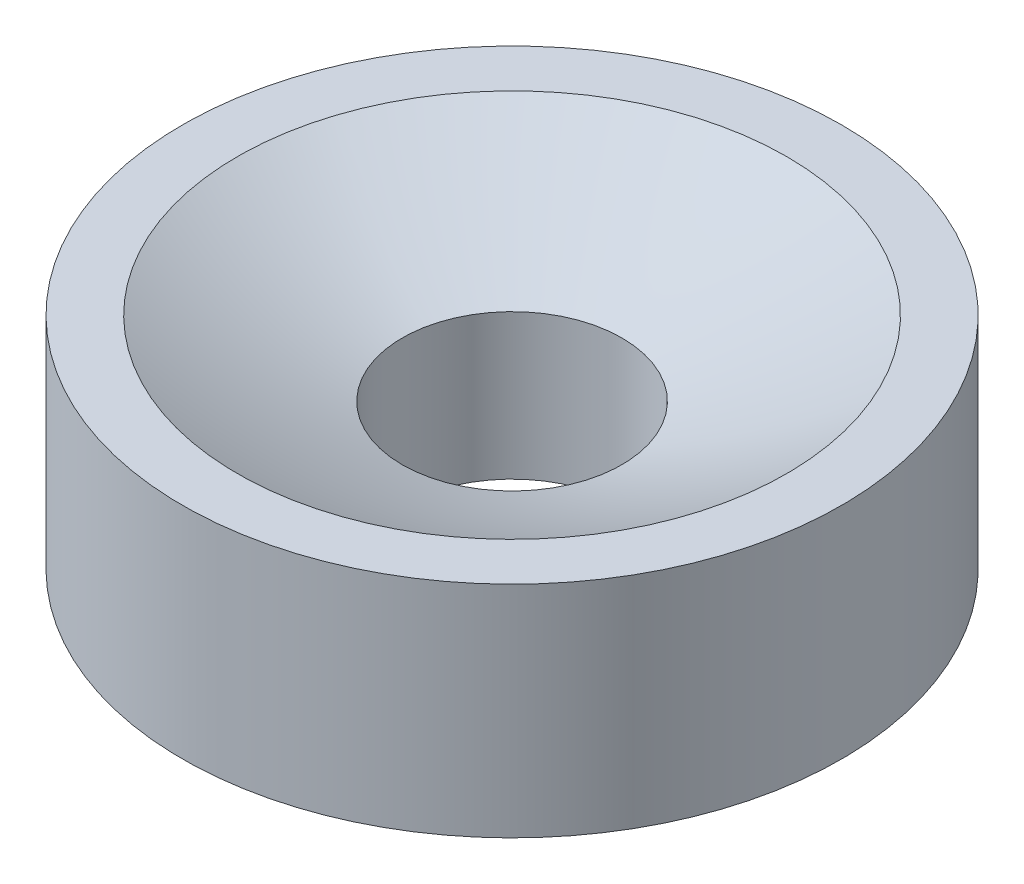
ISO-10303-21;
HEADER;
FILE_DESCRIPTION(('STEP AP214'),'2;1');
FILE_NAME('part.step','',(''),(''),'','','');
FILE_SCHEMA(('AUTOMOTIVE_DESIGN { 1 0 10303 214 1 1 1 1 }'));
ENDSEC;
DATA;
#1=APPLICATION_CONTEXT('core data for automotive mechanical design processes');
#2=APPLICATION_PROTOCOL_DEFINITION('international standard','automotive_design',2000,#1);
#3=PRODUCT_CONTEXT('',#1,'mechanical');
#4=PRODUCT('Part','Part','',(#3));
#5=PRODUCT_RELATED_PRODUCT_CATEGORY('part','',(#4));
#6=PRODUCT_DEFINITION_FORMATION('','',#4);
#7=PRODUCT_DEFINITION_CONTEXT('part definition',#1,'design');
#8=PRODUCT_DEFINITION('design','',#6,#7);
#9=PRODUCT_DEFINITION_SHAPE('','',#8);
#10=(LENGTH_UNIT() NAMED_UNIT(*) SI_UNIT(.MILLI.,.METRE.));
#11=(NAMED_UNIT(*) PLANE_ANGLE_UNIT() SI_UNIT($,.RADIAN.));
#12=(NAMED_UNIT(*) SI_UNIT($,.STERADIAN.) SOLID_ANGLE_UNIT());
#13=UNCERTAINTY_MEASURE_WITH_UNIT(LENGTH_MEASURE(1.E-05),#10,'distance_accuracy_value','');
#14=(GEOMETRIC_REPRESENTATION_CONTEXT(3) GLOBAL_UNCERTAINTY_ASSIGNED_CONTEXT((#13)) GLOBAL_UNIT_ASSIGNED_CONTEXT((#10,
#11,#12)) REPRESENTATION_CONTEXT('',''));
#15=CARTESIAN_POINT('',(0.,0.,0.));
#16=DIRECTION('',(0.,0.,1.));
#17=DIRECTION('',(1.,0.,0.));
#18=AXIS2_PLACEMENT_3D('',#15,#16,#17);
#19=CARTESIAN_POINT('',(5.,4.,0.));
#20=CARTESIAN_POINT('',(2.61657315248797,2.71166435612364,0.));
#21=CARTESIAN_POINT('',(0.,2.,0.));
#22=B_SPLINE_CURVE_WITH_KNOTS('',2,(#19,#20,#21),.UNSPECIFIED.,.F.,.F.,(3,3),(0.,1.),.UNSPECIFIED.);
#23=CARTESIAN_POINT('',(0.,0.,0.));
#24=DIRECTION('',(0.,-1.,0.));
#25=AXIS1_PLACEMENT('',#23,#24);
#26=SURFACE_OF_REVOLUTION('',#22,#25);
#27=CARTESIAN_POINT('',(0.,4.,0.));
#28=DIRECTION('',(0.,-1.,0.));
#29=DIRECTION('',(0.,0.,-1.));
#30=AXIS2_PLACEMENT_3D('',#27,#28,#29);
#31=CIRCLE('',#30,5.);
#32=CARTESIAN_POINT('',(0.,4.,-5.));
#33=VERTEX_POINT('',#32);
#34=EDGE_CURVE('E10',#33,#33,#31,.T.);
#35=ORIENTED_EDGE('',*,*,#34,.F.);
#36=EDGE_LOOP('',(#35));
#37=FACE_BOUND('',#36,.T.);
#38=CARTESIAN_POINT('',(0.,2.6407839448454,0.));
#39=DIRECTION('',(0.,-1.,0.));
#40=DIRECTION('',(0.,0.,-1.));
#41=AXIS2_PLACEMENT_3D('',#38,#39,#40);
#42=CIRCLE('',#41,2.);
#43=CARTESIAN_POINT('',(0.,2.6407839448454,-2.));
#44=VERTEX_POINT('',#43);
#45=EDGE_CURVE('E46',#44,#44,#42,.T.);
#46=ORIENTED_EDGE('',*,*,#45,.T.);
#47=EDGE_LOOP('',(#46));
#48=FACE_BOUND('',#47,.T.);
#49=ADVANCED_FACE('F31',(#37,#48),#26,.F.);
#50=CARTESIAN_POINT('',(6.,4.,0.));
#51=DIRECTION('',(0.,1.,0.));
#52=DIRECTION('',(0.,0.,1.));
#53=AXIS2_PLACEMENT_3D('',#50,#51,#52);
#54=PLANE('',#53);
#55=ORIENTED_EDGE('',*,*,#34,.T.);
#56=EDGE_LOOP('',(#55));
#57=FACE_BOUND('',#56,.T.);
#58=CARTESIAN_POINT('',(0.,4.,0.));
#59=DIRECTION('',(0.,-1.,0.));
#60=DIRECTION('',(0.,0.,-1.));
#61=AXIS2_PLACEMENT_3D('',#58,#59,#60);
#62=CIRCLE('',#61,6.);
#63=CARTESIAN_POINT('',(0.,4.,-6.));
#64=VERTEX_POINT('',#63);
#65=EDGE_CURVE('E38',#64,#64,#62,.T.);
#66=ORIENTED_EDGE('',*,*,#65,.F.);
#67=EDGE_LOOP('',(#66));
#68=FACE_BOUND('',#67,.T.);
#69=ADVANCED_FACE('F75',(#57,#68),#54,.T.);
#70=CARTESIAN_POINT('',(0.,0.,0.));
#71=DIRECTION('',(0.,-1.,0.));
#72=DIRECTION('',(0.,0.,-1.));
#73=AXIS2_PLACEMENT_3D('',#70,#71,#72);
#74=CYLINDRICAL_SURFACE('',#73,6.);
#75=ORIENTED_EDGE('',*,*,#65,.T.);
#76=EDGE_LOOP('',(#75));
#77=FACE_BOUND('',#76,.T.);
#78=CARTESIAN_POINT('',(0.,0.,0.));
#79=DIRECTION('',(0.,-1.,0.));
#80=DIRECTION('',(0.,0.,-1.));
#81=AXIS2_PLACEMENT_3D('',#78,#79,#80);
#82=CIRCLE('',#81,6.);
#83=CARTESIAN_POINT('',(0.,0.,-6.));
#84=VERTEX_POINT('',#83);
#85=EDGE_CURVE('E42',#84,#84,#82,.T.);
#86=ORIENTED_EDGE('',*,*,#85,.F.);
#87=EDGE_LOOP('',(#86));
#88=FACE_BOUND('',#87,.T.);
#89=ADVANCED_FACE('F71',(#77,#88),#74,.T.);
#90=CARTESIAN_POINT('',(0.,0.,0.));
#91=DIRECTION('',(0.,-1.,0.));
#92=DIRECTION('',(0.,0.,-1.));
#93=AXIS2_PLACEMENT_3D('',#90,#91,#92);
#94=PLANE('',#93);
#95=CARTESIAN_POINT('',(0.,0.,0.));
#96=DIRECTION('',(0.,1.,0.));
#97=DIRECTION('',(0.,0.,1.));
#98=AXIS2_PLACEMENT_3D('',#95,#96,#97);
#99=CIRCLE('',#98,2.);
#100=CARTESIAN_POINT('',(0.,0.,2.));
#101=VERTEX_POINT('',#100);
#102=EDGE_CURVE('E57',#101,#101,#99,.T.);
#103=ORIENTED_EDGE('',*,*,#102,.T.);
#104=EDGE_LOOP('',(#103));
#105=FACE_BOUND('',#104,.T.);
#106=ORIENTED_EDGE('',*,*,#85,.T.);
#107=EDGE_LOOP('',(#106));
#108=FACE_BOUND('',#107,.T.);
#109=ADVANCED_FACE('F61',(#105,#108),#94,.T.);
#110=CARTESIAN_POINT('',(0.,13.,0.));
#111=DIRECTION('',(0.,-1.,0.));
#112=DIRECTION('',(0.,0.,-1.));
#113=AXIS2_PLACEMENT_3D('',#110,#111,#112);
#114=CYLINDRICAL_SURFACE('',#113,2.);
#115=ORIENTED_EDGE('',*,*,#45,.F.);
#116=EDGE_LOOP('',(#115));
#117=FACE_BOUND('',#116,.T.);
#118=ORIENTED_EDGE('',*,*,#102,.F.);
#119=EDGE_LOOP('',(#118));
#120=FACE_BOUND('',#119,.T.);
#121=ADVANCED_FACE('F64',(#117,#120),#114,.F.);
#122=CLOSED_SHELL('',(#49,#69,#89,#109,#121));
#123=MANIFOLD_SOLID_BREP('B2',#122);
#124=ADVANCED_BREP_SHAPE_REPRESENTATION('',(#18,#123),#14);
#125=SHAPE_DEFINITION_REPRESENTATION(#9,#124);
ENDSEC;
END-ISO-10303-21;
